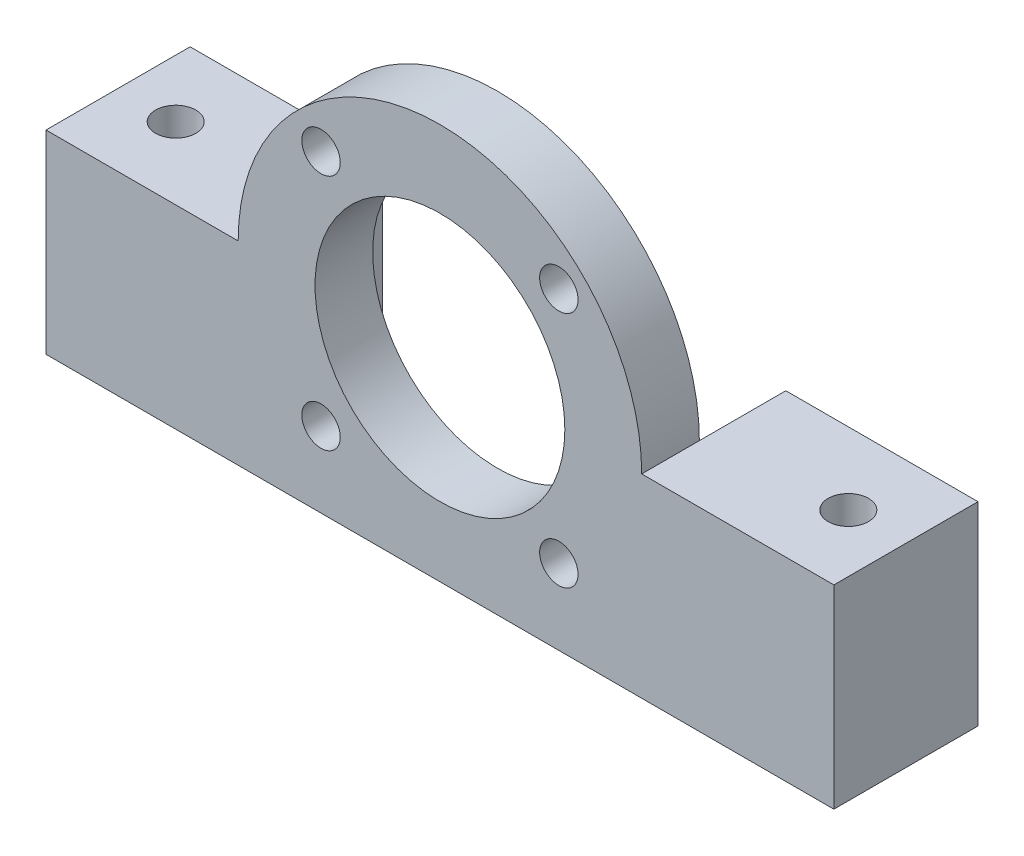
ISO-10303-21;
HEADER;
FILE_DESCRIPTION(('STEP AP214'),'2;1');
FILE_NAME('part.step','',(''),(''),'','','');
FILE_SCHEMA(('AUTOMOTIVE_DESIGN { 1 0 10303 214 1 1 1 1 }'));
ENDSEC;
DATA;
#1=APPLICATION_CONTEXT('core data for automotive mechanical design processes');
#2=APPLICATION_PROTOCOL_DEFINITION('international standard','automotive_design',2000,#1);
#3=PRODUCT_CONTEXT('',#1,'mechanical');
#4=PRODUCT('Part','Part','',(#3));
#5=PRODUCT_RELATED_PRODUCT_CATEGORY('part','',(#4));
#6=PRODUCT_DEFINITION_FORMATION('','',#4);
#7=PRODUCT_DEFINITION_CONTEXT('part definition',#1,'design');
#8=PRODUCT_DEFINITION('design','',#6,#7);
#9=PRODUCT_DEFINITION_SHAPE('','',#8);
#10=(LENGTH_UNIT() NAMED_UNIT(*) SI_UNIT(.MILLI.,.METRE.));
#11=(NAMED_UNIT(*) PLANE_ANGLE_UNIT() SI_UNIT($,.RADIAN.));
#12=(NAMED_UNIT(*) SI_UNIT($,.STERADIAN.) SOLID_ANGLE_UNIT());
#13=UNCERTAINTY_MEASURE_WITH_UNIT(LENGTH_MEASURE(1.E-05),#10,'distance_accuracy_value','');
#14=(GEOMETRIC_REPRESENTATION_CONTEXT(3) GLOBAL_UNCERTAINTY_ASSIGNED_CONTEXT((#13)) GLOBAL_UNIT_ASSIGNED_CONTEXT((#10,
#11,#12)) REPRESENTATION_CONTEXT('',''));
#15=CARTESIAN_POINT('',(0.,0.,0.));
#16=DIRECTION('',(0.,0.,1.));
#17=DIRECTION('',(1.,0.,0.));
#18=AXIS2_PLACEMENT_3D('',#15,#16,#17);
#19=CARTESIAN_POINT('',(0.,20.22,6.));
#20=DIRECTION('',(0.,0.,1.));
#21=DIRECTION('',(1.,0.,0.));
#22=AXIS2_PLACEMENT_3D('',#19,#20,#21);
#23=PLANE('',#22);
#24=CARTESIAN_POINT('',(12.3743686707646,7.84563132923545,6.));
#25=DIRECTION('',(0.,0.,1.));
#26=DIRECTION('',(1.,0.,0.));
#27=AXIS2_PLACEMENT_3D('',#24,#25,#26);
#28=CIRCLE('',#27,2.);
#29=CARTESIAN_POINT('',(14.3743686707646,7.84563132923545,6.));
#30=VERTEX_POINT('',#29);
#31=EDGE_CURVE('E180',#30,#30,#28,.T.);
#32=ORIENTED_EDGE('',*,*,#31,.F.);
#33=EDGE_LOOP('',(#32));
#34=FACE_BOUND('',#33,.T.);
#35=CARTESIAN_POINT('',(-12.3743686707646,32.5943686707646,6.));
#36=DIRECTION('',(0.,0.,1.));
#37=DIRECTION('',(1.,0.,0.));
#38=AXIS2_PLACEMENT_3D('',#35,#36,#37);
#39=CIRCLE('',#38,2.);
#40=CARTESIAN_POINT('',(-10.3743686707646,32.5943686707646,6.));
#41=VERTEX_POINT('',#40);
#42=EDGE_CURVE('E192',#41,#41,#39,.T.);
#43=ORIENTED_EDGE('',*,*,#42,.F.);
#44=EDGE_LOOP('',(#43));
#45=FACE_BOUND('',#44,.T.);
#46=CARTESIAN_POINT('',(0.,20.22,6.));
#47=DIRECTION('',(0.,0.,1.));
#48=DIRECTION('',(1.,0.,0.));
#49=AXIS2_PLACEMENT_3D('',#46,#47,#48);
#50=CIRCLE('',#49,21.);
#51=CARTESIAN_POINT('',(21.,20.22,6.));
#52=VERTEX_POINT('',#51);
#53=CARTESIAN_POINT('',(-21.,20.22,6.));
#54=VERTEX_POINT('',#53);
#55=EDGE_CURVE('E121',#52,#54,#50,.T.);
#56=ORIENTED_EDGE('',*,*,#55,.T.);
#57=DIRECTION('',(-1.,0.,0.));
#58=VECTOR('',#57,1.);
#59=CARTESIAN_POINT('',(-41.,20.22,6.));
#60=LINE('',#59,#58);
#61=CARTESIAN_POINT('',(-41.,20.22,6.));
#62=VERTEX_POINT('',#61);
#63=EDGE_CURVE('E137',#54,#62,#60,.T.);
#64=ORIENTED_EDGE('',*,*,#63,.T.);
#65=DIRECTION('',(0.,-1.,0.));
#66=VECTOR('',#65,1.);
#67=CARTESIAN_POINT('',(-41.,20.22,6.));
#68=LINE('',#67,#66);
#69=CARTESIAN_POINT('',(-41.,0.,6.));
#70=VERTEX_POINT('',#69);
#71=EDGE_CURVE('E118',#62,#70,#68,.T.);
#72=ORIENTED_EDGE('',*,*,#71,.T.);
#73=DIRECTION('',(1.,0.,0.));
#74=VECTOR('',#73,1.);
#75=CARTESIAN_POINT('',(-21.,0.,6.));
#76=LINE('',#75,#74);
#77=CARTESIAN_POINT('',(41.,0.,6.));
#78=VERTEX_POINT('',#77);
#79=EDGE_CURVE('E111',#70,#78,#76,.T.);
#80=ORIENTED_EDGE('',*,*,#79,.T.);
#81=DIRECTION('',(0.,1.,0.));
#82=VECTOR('',#81,1.);
#83=CARTESIAN_POINT('',(41.,20.22,6.));
#84=LINE('',#83,#82);
#85=CARTESIAN_POINT('',(41.,20.22,6.));
#86=VERTEX_POINT('',#85);
#87=EDGE_CURVE('E115',#78,#86,#84,.T.);
#88=ORIENTED_EDGE('',*,*,#87,.T.);
#89=DIRECTION('',(-1.,0.,0.));
#90=VECTOR('',#89,1.);
#91=CARTESIAN_POINT('',(41.,20.22,6.));
#92=LINE('',#91,#90);
#93=EDGE_CURVE('E60',#86,#52,#92,.T.);
#94=ORIENTED_EDGE('',*,*,#93,.T.);
#95=EDGE_LOOP('',(#56,#64,#72,#80,#88,#94));
#96=FACE_BOUND('',#95,.T.);
#97=CARTESIAN_POINT('',(0.,20.22,6.));
#98=DIRECTION('',(0.,0.,1.));
#99=DIRECTION('',(1.,0.,0.));
#100=AXIS2_PLACEMENT_3D('',#97,#98,#99);
#101=CIRCLE('',#100,13.);
#102=CARTESIAN_POINT('',(13.,20.22,6.));
#103=VERTEX_POINT('',#102);
#104=EDGE_CURVE('E198',#103,#103,#101,.T.);
#105=ORIENTED_EDGE('',*,*,#104,.F.);
#106=EDGE_LOOP('',(#105));
#107=FACE_BOUND('',#106,.T.);
#108=CARTESIAN_POINT('',(12.3743686707646,32.5943686707647,6.));
#109=DIRECTION('',(0.,0.,1.));
#110=DIRECTION('',(1.,0.,0.));
#111=AXIS2_PLACEMENT_3D('',#108,#109,#110);
#112=CIRCLE('',#111,2.00000000000001);
#113=CARTESIAN_POINT('',(14.3743686707646,32.5943686707647,6.));
#114=VERTEX_POINT('',#113);
#115=EDGE_CURVE('E186',#114,#114,#112,.T.);
#116=ORIENTED_EDGE('',*,*,#115,.F.);
#117=EDGE_LOOP('',(#116));
#118=FACE_BOUND('',#117,.T.);
#119=CARTESIAN_POINT('',(-12.3743686707646,7.84563132923539,6.));
#120=DIRECTION('',(0.,0.,1.));
#121=DIRECTION('',(1.,0.,0.));
#122=AXIS2_PLACEMENT_3D('',#119,#120,#121);
#123=CIRCLE('',#122,2.);
#124=CARTESIAN_POINT('',(-10.3743686707646,7.84563132923539,6.));
#125=VERTEX_POINT('',#124);
#126=EDGE_CURVE('E174',#125,#125,#123,.T.);
#127=ORIENTED_EDGE('',*,*,#126,.F.);
#128=EDGE_LOOP('',(#127));
#129=FACE_BOUND('',#128,.T.);
#130=ADVANCED_FACE('F45',(#34,#45,#96,#107,#118,#129),#23,.T.);
#131=CARTESIAN_POINT('',(0.,20.22,0.));
#132=DIRECTION('',(0.,0.,1.));
#133=DIRECTION('',(1.,0.,0.));
#134=AXIS2_PLACEMENT_3D('',#131,#132,#133);
#135=PLANE('',#134);
#136=CARTESIAN_POINT('',(0.,20.22,0.));
#137=DIRECTION('',(0.,0.,1.));
#138=DIRECTION('',(1.,0.,0.));
#139=AXIS2_PLACEMENT_3D('',#136,#137,#138);
#140=CIRCLE('',#139,21.);
#141=CARTESIAN_POINT('',(21.,20.22,0.));
#142=VERTEX_POINT('',#141);
#143=CARTESIAN_POINT('',(-21.,20.22,0.));
#144=VERTEX_POINT('',#143);
#145=EDGE_CURVE('E201',#142,#144,#140,.T.);
#146=ORIENTED_EDGE('',*,*,#145,.F.);
#147=DIRECTION('',(0.,1.,0.));
#148=VECTOR('',#147,1.);
#149=CARTESIAN_POINT('',(21.,0.,0.));
#150=LINE('',#149,#148);
#151=CARTESIAN_POINT('',(21.,0.,0.));
#152=VERTEX_POINT('',#151);
#153=EDGE_CURVE('E204',#152,#142,#150,.T.);
#154=ORIENTED_EDGE('',*,*,#153,.F.);
#155=DIRECTION('',(1.,0.,0.));
#156=VECTOR('',#155,1.);
#157=CARTESIAN_POINT('',(-21.,0.,0.));
#158=LINE('',#157,#156);
#159=CARTESIAN_POINT('',(-21.,0.,0.));
#160=VERTEX_POINT('',#159);
#161=EDGE_CURVE('E211',#160,#152,#158,.T.);
#162=ORIENTED_EDGE('',*,*,#161,.F.);
#163=DIRECTION('',(0.,-1.,0.));
#164=VECTOR('',#163,1.);
#165=CARTESIAN_POINT('',(-21.,20.22,0.));
#166=LINE('',#165,#164);
#167=EDGE_CURVE('E208',#144,#160,#166,.T.);
#168=ORIENTED_EDGE('',*,*,#167,.F.);
#169=EDGE_LOOP('',(#146,#154,#162,#168));
#170=FACE_BOUND('',#169,.T.);
#171=CARTESIAN_POINT('',(0.,20.22,0.));
#172=DIRECTION('',(0.,0.,1.));
#173=DIRECTION('',(1.,0.,0.));
#174=AXIS2_PLACEMENT_3D('',#171,#172,#173);
#175=CIRCLE('',#174,13.);
#176=CARTESIAN_POINT('',(13.,20.22,0.));
#177=VERTEX_POINT('',#176);
#178=EDGE_CURVE('E195',#177,#177,#175,.T.);
#179=ORIENTED_EDGE('',*,*,#178,.T.);
#180=EDGE_LOOP('',(#179));
#181=FACE_BOUND('',#180,.T.);
#182=CARTESIAN_POINT('',(-12.3743686707646,32.5943686707646,0.));
#183=DIRECTION('',(0.,0.,1.));
#184=DIRECTION('',(1.,0.,0.));
#185=AXIS2_PLACEMENT_3D('',#182,#183,#184);
#186=CIRCLE('',#185,2.);
#187=CARTESIAN_POINT('',(-10.3743686707646,32.5943686707646,0.));
#188=VERTEX_POINT('',#187);
#189=EDGE_CURVE('E189',#188,#188,#186,.T.);
#190=ORIENTED_EDGE('',*,*,#189,.T.);
#191=EDGE_LOOP('',(#190));
#192=FACE_BOUND('',#191,.T.);
#193=CARTESIAN_POINT('',(12.3743686707646,32.5943686707647,0.));
#194=DIRECTION('',(0.,0.,1.));
#195=DIRECTION('',(1.,0.,0.));
#196=AXIS2_PLACEMENT_3D('',#193,#194,#195);
#197=CIRCLE('',#196,2.00000000000001);
#198=CARTESIAN_POINT('',(14.3743686707646,32.5943686707647,0.));
#199=VERTEX_POINT('',#198);
#200=EDGE_CURVE('E183',#199,#199,#197,.T.);
#201=ORIENTED_EDGE('',*,*,#200,.T.);
#202=EDGE_LOOP('',(#201));
#203=FACE_BOUND('',#202,.T.);
#204=CARTESIAN_POINT('',(12.3743686707646,7.84563132923545,0.));
#205=DIRECTION('',(0.,0.,1.));
#206=DIRECTION('',(1.,0.,0.));
#207=AXIS2_PLACEMENT_3D('',#204,#205,#206);
#208=CIRCLE('',#207,2.);
#209=CARTESIAN_POINT('',(14.3743686707646,7.84563132923545,0.));
#210=VERTEX_POINT('',#209);
#211=EDGE_CURVE('E177',#210,#210,#208,.T.);
#212=ORIENTED_EDGE('',*,*,#211,.T.);
#213=EDGE_LOOP('',(#212));
#214=FACE_BOUND('',#213,.T.);
#215=CARTESIAN_POINT('',(-12.3743686707646,7.84563132923539,0.));
#216=DIRECTION('',(0.,0.,1.));
#217=DIRECTION('',(1.,0.,0.));
#218=AXIS2_PLACEMENT_3D('',#215,#216,#217);
#219=CIRCLE('',#218,2.);
#220=CARTESIAN_POINT('',(-10.3743686707646,7.84563132923539,0.));
#221=VERTEX_POINT('',#220);
#222=EDGE_CURVE('E167',#221,#221,#219,.T.);
#223=ORIENTED_EDGE('',*,*,#222,.T.);
#224=EDGE_LOOP('',(#223));
#225=FACE_BOUND('',#224,.T.);
#226=ADVANCED_FACE('F223',(#170,#181,#192,#203,#214,#225),#135,.F.);
#227=CARTESIAN_POINT('',(0.,20.22,6.));
#228=DIRECTION('',(0.,0.,-1.));
#229=DIRECTION('',(-1.,0.,0.));
#230=AXIS2_PLACEMENT_3D('',#227,#228,#229);
#231=CYLINDRICAL_SURFACE('',#230,21.);
#232=ORIENTED_EDGE('',*,*,#145,.T.);
#233=DIRECTION('',(0.,0.,-1.));
#234=VECTOR('',#233,1.);
#235=CARTESIAN_POINT('',(-21.,20.22,6.));
#236=LINE('',#235,#234);
#237=EDGE_CURVE('E11',#54,#144,#236,.T.);
#238=ORIENTED_EDGE('',*,*,#237,.F.);
#239=ORIENTED_EDGE('',*,*,#55,.F.);
#240=DIRECTION('',(0.,0.,-1.));
#241=VECTOR('',#240,1.);
#242=CARTESIAN_POINT('',(21.,20.22,6.));
#243=LINE('',#242,#241);
#244=EDGE_CURVE('E54',#52,#142,#243,.T.);
#245=ORIENTED_EDGE('',*,*,#244,.T.);
#246=EDGE_LOOP('',(#232,#238,#239,#245));
#247=FACE_BOUND('',#246,.T.);
#248=ADVANCED_FACE('F47',(#247),#231,.T.);
#249=CARTESIAN_POINT('',(-21.,0.,6.));
#250=DIRECTION('',(0.,1.,0.));
#251=DIRECTION('',(0.,0.,1.));
#252=AXIS2_PLACEMENT_3D('',#249,#250,#251);
#253=PLANE('',#252);
#254=CARTESIAN_POINT('',(-35.,0.,-1.5));
#255=DIRECTION('',(0.,1.,0.));
#256=DIRECTION('',(-1.,0.,0.));
#257=AXIS2_PLACEMENT_3D('',#254,#255,#256);
#258=CIRCLE('',#257,2.1);
#259=CARTESIAN_POINT('',(-37.1,0.,-1.5));
#260=VERTEX_POINT('',#259);
#261=EDGE_CURVE('E133',#260,#260,#258,.T.);
#262=ORIENTED_EDGE('',*,*,#261,.T.);
#263=EDGE_LOOP('',(#262));
#264=FACE_BOUND('',#263,.T.);
#265=CARTESIAN_POINT('',(35.,0.,-1.5));
#266=DIRECTION('',(0.,1.,0.));
#267=DIRECTION('',(1.,0.,0.));
#268=AXIS2_PLACEMENT_3D('',#265,#266,#267);
#269=CIRCLE('',#268,2.1);
#270=CARTESIAN_POINT('',(37.1,0.,-1.5));
#271=VERTEX_POINT('',#270);
#272=EDGE_CURVE('E250',#271,#271,#269,.T.);
#273=ORIENTED_EDGE('',*,*,#272,.T.);
#274=EDGE_LOOP('',(#273));
#275=FACE_BOUND('',#274,.T.);
#276=ORIENTED_EDGE('',*,*,#161,.T.);
#277=DIRECTION('',(0.,0.,1.));
#278=VECTOR('',#277,1.);
#279=CARTESIAN_POINT('',(21.,0.,-9.));
#280=LINE('',#279,#278);
#281=CARTESIAN_POINT('',(21.,0.,-9.));
#282=VERTEX_POINT('',#281);
#283=EDGE_CURVE('E132',#282,#152,#280,.T.);
#284=ORIENTED_EDGE('',*,*,#283,.F.);
#285=DIRECTION('',(1.,0.,0.));
#286=VECTOR('',#285,1.);
#287=CARTESIAN_POINT('',(41.,0.,-9.));
#288=LINE('',#287,#286);
#289=CARTESIAN_POINT('',(41.,0.,-9.));
#290=VERTEX_POINT('',#289);
#291=EDGE_CURVE('E128',#282,#290,#288,.T.);
#292=ORIENTED_EDGE('',*,*,#291,.T.);
#293=DIRECTION('',(0.,0.,1.));
#294=VECTOR('',#293,1.);
#295=CARTESIAN_POINT('',(41.,0.,-9.));
#296=LINE('',#295,#294);
#297=EDGE_CURVE('E124',#290,#78,#296,.T.);
#298=ORIENTED_EDGE('',*,*,#297,.T.);
#299=ORIENTED_EDGE('',*,*,#79,.F.);
#300=DIRECTION('',(0.,0.,1.));
#301=VECTOR('',#300,1.);
#302=CARTESIAN_POINT('',(-41.,0.,-9.));
#303=LINE('',#302,#301);
#304=CARTESIAN_POINT('',(-41.,0.,-9.));
#305=VERTEX_POINT('',#304);
#306=EDGE_CURVE('E168',#305,#70,#303,.T.);
#307=ORIENTED_EDGE('',*,*,#306,.F.);
#308=DIRECTION('',(1.,0.,0.));
#309=VECTOR('',#308,1.);
#310=CARTESIAN_POINT('',(-41.,0.,-9.));
#311=LINE('',#310,#309);
#312=CARTESIAN_POINT('',(-21.,0.,-9.));
#313=VERTEX_POINT('',#312);
#314=EDGE_CURVE('E160',#305,#313,#311,.T.);
#315=ORIENTED_EDGE('',*,*,#314,.T.);
#316=DIRECTION('',(0.,0.,1.));
#317=VECTOR('',#316,1.);
#318=CARTESIAN_POINT('',(-21.,0.,-9.));
#319=LINE('',#318,#317);
#320=EDGE_CURVE('E165',#313,#160,#319,.T.);
#321=ORIENTED_EDGE('',*,*,#320,.T.);
#322=EDGE_LOOP('',(#276,#284,#292,#298,#299,#307,#315,#321));
#323=FACE_BOUND('',#322,.T.);
#324=ADVANCED_FACE('F126',(#264,#275,#323),#253,.F.);
#325=CARTESIAN_POINT('',(0.,20.22,6.));
#326=DIRECTION('',(0.,0.,-1.));
#327=DIRECTION('',(-1.,0.,0.));
#328=AXIS2_PLACEMENT_3D('',#325,#326,#327);
#329=CYLINDRICAL_SURFACE('',#328,13.);
#330=ORIENTED_EDGE('',*,*,#104,.T.);
#331=EDGE_LOOP('',(#330));
#332=FACE_BOUND('',#331,.T.);
#333=ORIENTED_EDGE('',*,*,#178,.F.);
#334=EDGE_LOOP('',(#333));
#335=FACE_BOUND('',#334,.T.);
#336=ADVANCED_FACE('F290',(#332,#335),#329,.F.);
#337=CARTESIAN_POINT('',(-12.3743686707646,32.5943686707646,6.));
#338=DIRECTION('',(0.,0.,-1.));
#339=DIRECTION('',(-1.,0.,0.));
#340=AXIS2_PLACEMENT_3D('',#337,#338,#339);
#341=CYLINDRICAL_SURFACE('',#340,2.);
#342=ORIENTED_EDGE('',*,*,#42,.T.);
#343=EDGE_LOOP('',(#342));
#344=FACE_BOUND('',#343,.T.);
#345=ORIENTED_EDGE('',*,*,#189,.F.);
#346=EDGE_LOOP('',(#345));
#347=FACE_BOUND('',#346,.T.);
#348=ADVANCED_FACE('F297',(#344,#347),#341,.F.);
#349=CARTESIAN_POINT('',(12.3743686707646,32.5943686707647,6.));
#350=DIRECTION('',(0.,0.,-1.));
#351=DIRECTION('',(-1.,0.,0.));
#352=AXIS2_PLACEMENT_3D('',#349,#350,#351);
#353=CYLINDRICAL_SURFACE('',#352,2.00000000000001);
#354=ORIENTED_EDGE('',*,*,#115,.T.);
#355=EDGE_LOOP('',(#354));
#356=FACE_BOUND('',#355,.T.);
#357=ORIENTED_EDGE('',*,*,#200,.F.);
#358=EDGE_LOOP('',(#357));
#359=FACE_BOUND('',#358,.T.);
#360=ADVANCED_FACE('F336',(#356,#359),#353,.F.);
#361=CARTESIAN_POINT('',(12.3743686707646,7.84563132923545,6.));
#362=DIRECTION('',(0.,0.,-1.));
#363=DIRECTION('',(-1.,0.,0.));
#364=AXIS2_PLACEMENT_3D('',#361,#362,#363);
#365=CYLINDRICAL_SURFACE('',#364,2.);
#366=ORIENTED_EDGE('',*,*,#31,.T.);
#367=EDGE_LOOP('',(#366));
#368=FACE_BOUND('',#367,.T.);
#369=ORIENTED_EDGE('',*,*,#211,.F.);
#370=EDGE_LOOP('',(#369));
#371=FACE_BOUND('',#370,.T.);
#372=ADVANCED_FACE('F324',(#368,#371),#365,.F.);
#373=CARTESIAN_POINT('',(-12.3743686707646,7.84563132923539,6.));
#374=DIRECTION('',(0.,0.,-1.));
#375=DIRECTION('',(-1.,0.,0.));
#376=AXIS2_PLACEMENT_3D('',#373,#374,#375);
#377=CYLINDRICAL_SURFACE('',#376,2.);
#378=ORIENTED_EDGE('',*,*,#126,.T.);
#379=EDGE_LOOP('',(#378));
#380=FACE_BOUND('',#379,.T.);
#381=ORIENTED_EDGE('',*,*,#222,.F.);
#382=EDGE_LOOP('',(#381));
#383=FACE_BOUND('',#382,.T.);
#384=ADVANCED_FACE('F319',(#380,#383),#377,.F.);
#385=CARTESIAN_POINT('',(-21.,20.22,-9.));
#386=DIRECTION('',(1.,0.,0.));
#387=DIRECTION('',(0.,0.,-1.));
#388=AXIS2_PLACEMENT_3D('',#385,#386,#387);
#389=PLANE('',#388);
#390=ORIENTED_EDGE('',*,*,#167,.T.);
#391=ORIENTED_EDGE('',*,*,#320,.F.);
#392=DIRECTION('',(0.,1.,0.));
#393=VECTOR('',#392,1.);
#394=CARTESIAN_POINT('',(-21.,20.22,-9.));
#395=LINE('',#394,#393);
#396=CARTESIAN_POINT('',(-21.,20.22,-9.));
#397=VERTEX_POINT('',#396);
#398=EDGE_CURVE('E151',#313,#397,#395,.T.);
#399=ORIENTED_EDGE('',*,*,#398,.T.);
#400=DIRECTION('',(0.,0.,1.));
#401=VECTOR('',#400,1.);
#402=CARTESIAN_POINT('',(-21.,20.22,-9.));
#403=LINE('',#402,#401);
#404=EDGE_CURVE('E162',#397,#144,#403,.T.);
#405=ORIENTED_EDGE('',*,*,#404,.T.);
#406=EDGE_LOOP('',(#390,#391,#399,#405));
#407=FACE_BOUND('',#406,.T.);
#408=ADVANCED_FACE('F227',(#407),#389,.T.);
#409=CARTESIAN_POINT('',(-41.,20.22,-9.));
#410=DIRECTION('',(-1.,0.,0.));
#411=DIRECTION('',(0.,0.,1.));
#412=AXIS2_PLACEMENT_3D('',#409,#410,#411);
#413=PLANE('',#412);
#414=ORIENTED_EDGE('',*,*,#71,.F.);
#415=DIRECTION('',(0.,0.,1.));
#416=VECTOR('',#415,1.);
#417=CARTESIAN_POINT('',(-41.,20.22,-9.));
#418=LINE('',#417,#416);
#419=CARTESIAN_POINT('',(-41.,20.22,-9.));
#420=VERTEX_POINT('',#419);
#421=EDGE_CURVE('E170',#420,#62,#418,.T.);
#422=ORIENTED_EDGE('',*,*,#421,.F.);
#423=DIRECTION('',(0.,-1.,0.));
#424=VECTOR('',#423,1.);
#425=CARTESIAN_POINT('',(-41.,20.22,-9.));
#426=LINE('',#425,#424);
#427=EDGE_CURVE('E157',#420,#305,#426,.T.);
#428=ORIENTED_EDGE('',*,*,#427,.T.);
#429=ORIENTED_EDGE('',*,*,#306,.T.);
#430=EDGE_LOOP('',(#414,#422,#428,#429));
#431=FACE_BOUND('',#430,.T.);
#432=ADVANCED_FACE('F237',(#431),#413,.T.);
#433=CARTESIAN_POINT('',(-41.,20.22,-9.));
#434=DIRECTION('',(0.,1.,0.));
#435=DIRECTION('',(0.,0.,1.));
#436=AXIS2_PLACEMENT_3D('',#433,#434,#435);
#437=PLANE('',#436);
#438=CARTESIAN_POINT('',(-35.,20.22,-1.5));
#439=DIRECTION('',(0.,1.,0.));
#440=DIRECTION('',(-1.,0.,0.));
#441=AXIS2_PLACEMENT_3D('',#438,#439,#440);
#442=CIRCLE('',#441,2.1);
#443=CARTESIAN_POINT('',(-37.1,20.22,-1.5));
#444=VERTEX_POINT('',#443);
#445=EDGE_CURVE('E256',#444,#444,#442,.T.);
#446=ORIENTED_EDGE('',*,*,#445,.F.);
#447=EDGE_LOOP('',(#446));
#448=FACE_BOUND('',#447,.T.);
#449=ORIENTED_EDGE('',*,*,#63,.F.);
#450=ORIENTED_EDGE('',*,*,#237,.T.);
#451=ORIENTED_EDGE('',*,*,#404,.F.);
#452=DIRECTION('',(-1.,0.,0.));
#453=VECTOR('',#452,1.);
#454=CARTESIAN_POINT('',(-41.,20.22,-9.));
#455=LINE('',#454,#453);
#456=EDGE_CURVE('E154',#397,#420,#455,.T.);
#457=ORIENTED_EDGE('',*,*,#456,.T.);
#458=ORIENTED_EDGE('',*,*,#421,.T.);
#459=EDGE_LOOP('',(#449,#450,#451,#457,#458));
#460=FACE_BOUND('',#459,.T.);
#461=ADVANCED_FACE('F231',(#448,#460),#437,.T.);
#462=CARTESIAN_POINT('',(0.,0.,-9.));
#463=DIRECTION('',(0.,0.,1.));
#464=DIRECTION('',(1.,0.,0.));
#465=AXIS2_PLACEMENT_3D('',#462,#463,#464);
#466=PLANE('',#465);
#467=ORIENTED_EDGE('',*,*,#398,.F.);
#468=ORIENTED_EDGE('',*,*,#314,.F.);
#469=ORIENTED_EDGE('',*,*,#427,.F.);
#470=ORIENTED_EDGE('',*,*,#456,.F.);
#471=EDGE_LOOP('',(#467,#468,#469,#470));
#472=FACE_BOUND('',#471,.T.);
#473=ADVANCED_FACE('F234',(#472),#466,.F.);
#474=CARTESIAN_POINT('',(21.,20.22,-9.));
#475=DIRECTION('',(-1.,0.,0.));
#476=DIRECTION('',(0.,-1.,0.));
#477=AXIS2_PLACEMENT_3D('',#474,#475,#476);
#478=PLANE('',#477);
#479=ORIENTED_EDGE('',*,*,#153,.T.);
#480=DIRECTION('',(0.,0.,1.));
#481=VECTOR('',#480,1.);
#482=CARTESIAN_POINT('',(21.,20.22,-9.));
#483=LINE('',#482,#481);
#484=CARTESIAN_POINT('',(21.,20.22,-9.));
#485=VERTEX_POINT('',#484);
#486=EDGE_CURVE('E239',#485,#142,#483,.T.);
#487=ORIENTED_EDGE('',*,*,#486,.F.);
#488=DIRECTION('',(0.,-1.,0.));
#489=VECTOR('',#488,1.);
#490=CARTESIAN_POINT('',(21.,20.22,-9.));
#491=LINE('',#490,#489);
#492=EDGE_CURVE('E144',#485,#282,#491,.T.);
#493=ORIENTED_EDGE('',*,*,#492,.T.);
#494=ORIENTED_EDGE('',*,*,#283,.T.);
#495=EDGE_LOOP('',(#479,#487,#493,#494));
#496=FACE_BOUND('',#495,.T.);
#497=ADVANCED_FACE('F242',(#496),#478,.T.);
#498=CARTESIAN_POINT('',(41.,20.22,-9.));
#499=DIRECTION('',(1.,0.,0.));
#500=DIRECTION('',(0.,0.,-1.));
#501=AXIS2_PLACEMENT_3D('',#498,#499,#500);
#502=PLANE('',#501);
#503=ORIENTED_EDGE('',*,*,#87,.F.);
#504=ORIENTED_EDGE('',*,*,#297,.F.);
#505=DIRECTION('',(0.,1.,0.));
#506=VECTOR('',#505,1.);
#507=CARTESIAN_POINT('',(41.,20.22,-9.));
#508=LINE('',#507,#506);
#509=CARTESIAN_POINT('',(41.,20.22,-9.));
#510=VERTEX_POINT('',#509);
#511=EDGE_CURVE('E140',#290,#510,#508,.T.);
#512=ORIENTED_EDGE('',*,*,#511,.T.);
#513=DIRECTION('',(0.,0.,1.));
#514=VECTOR('',#513,1.);
#515=CARTESIAN_POINT('',(41.,20.22,-9.));
#516=LINE('',#515,#514);
#517=EDGE_CURVE('E136',#510,#86,#516,.T.);
#518=ORIENTED_EDGE('',*,*,#517,.T.);
#519=EDGE_LOOP('',(#503,#504,#512,#518));
#520=FACE_BOUND('',#519,.T.);
#521=ADVANCED_FACE('F135',(#520),#502,.T.);
#522=CARTESIAN_POINT('',(41.,20.22,-9.));
#523=DIRECTION('',(0.,1.,0.));
#524=DIRECTION('',(-1.,0.,0.));
#525=AXIS2_PLACEMENT_3D('',#522,#523,#524);
#526=PLANE('',#525);
#527=CARTESIAN_POINT('',(35.,20.22,-1.5));
#528=DIRECTION('',(0.,1.,0.));
#529=DIRECTION('',(1.,0.,0.));
#530=AXIS2_PLACEMENT_3D('',#527,#528,#529);
#531=CIRCLE('',#530,2.1);
#532=CARTESIAN_POINT('',(37.1,20.22,-1.5));
#533=VERTEX_POINT('',#532);
#534=EDGE_CURVE('E253',#533,#533,#531,.T.);
#535=ORIENTED_EDGE('',*,*,#534,.F.);
#536=EDGE_LOOP('',(#535));
#537=FACE_BOUND('',#536,.T.);
#538=ORIENTED_EDGE('',*,*,#93,.F.);
#539=ORIENTED_EDGE('',*,*,#517,.F.);
#540=DIRECTION('',(-1.,0.,0.));
#541=VECTOR('',#540,1.);
#542=CARTESIAN_POINT('',(41.,20.22,-9.));
#543=LINE('',#542,#541);
#544=EDGE_CURVE('E147',#510,#485,#543,.T.);
#545=ORIENTED_EDGE('',*,*,#544,.T.);
#546=ORIENTED_EDGE('',*,*,#486,.T.);
#547=ORIENTED_EDGE('',*,*,#244,.F.);
#548=EDGE_LOOP('',(#538,#539,#545,#546,#547));
#549=FACE_BOUND('',#548,.T.);
#550=ADVANCED_FACE('F246',(#537,#549),#526,.T.);
#551=CARTESIAN_POINT('',(0.,0.,-9.));
#552=DIRECTION('',(0.,0.,-1.));
#553=DIRECTION('',(-1.,0.,0.));
#554=AXIS2_PLACEMENT_3D('',#551,#552,#553);
#555=PLANE('',#554);
#556=ORIENTED_EDGE('',*,*,#511,.F.);
#557=ORIENTED_EDGE('',*,*,#291,.F.);
#558=ORIENTED_EDGE('',*,*,#492,.F.);
#559=ORIENTED_EDGE('',*,*,#544,.F.);
#560=EDGE_LOOP('',(#556,#557,#558,#559));
#561=FACE_BOUND('',#560,.T.);
#562=ADVANCED_FACE('F245',(#561),#555,.T.);
#563=CARTESIAN_POINT('',(35.,0.,-1.5));
#564=DIRECTION('',(0.,1.,0.));
#565=DIRECTION('',(-1.,0.,0.));
#566=AXIS2_PLACEMENT_3D('',#563,#564,#565);
#567=CYLINDRICAL_SURFACE('',#566,2.1);
#568=ORIENTED_EDGE('',*,*,#272,.F.);
#569=EDGE_LOOP('',(#568));
#570=FACE_BOUND('',#569,.T.);
#571=ORIENTED_EDGE('',*,*,#534,.T.);
#572=EDGE_LOOP('',(#571));
#573=FACE_BOUND('',#572,.T.);
#574=ADVANCED_FACE('F267',(#570,#573),#567,.F.);
#575=CARTESIAN_POINT('',(-35.,0.,-1.5));
#576=DIRECTION('',(0.,1.,0.));
#577=DIRECTION('',(-1.,0.,0.));
#578=AXIS2_PLACEMENT_3D('',#575,#576,#577);
#579=CYLINDRICAL_SURFACE('',#578,2.1);
#580=ORIENTED_EDGE('',*,*,#261,.F.);
#581=EDGE_LOOP('',(#580));
#582=FACE_BOUND('',#581,.T.);
#583=ORIENTED_EDGE('',*,*,#445,.T.);
#584=EDGE_LOOP('',(#583));
#585=FACE_BOUND('',#584,.T.);
#586=ADVANCED_FACE('F264',(#582,#585),#579,.F.);
#587=CLOSED_SHELL('',(#130,#226,#248,#324,#336,#348,#360,#372,#384,#408,#432,#461,#473,#497,
#521,#550,#562,#574,#586));
#588=MANIFOLD_SOLID_BREP('B2',#587);
#589=ADVANCED_BREP_SHAPE_REPRESENTATION('',(#18,#588),#14);
#590=SHAPE_DEFINITION_REPRESENTATION(#9,#589);
ENDSEC;
END-ISO-10303-21;
